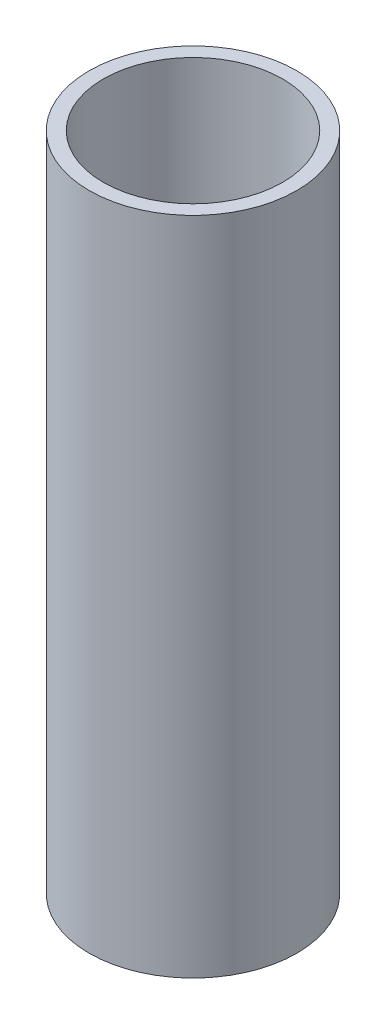
ISO-10303-21;
HEADER;
FILE_DESCRIPTION(('STEP AP214'),'2;1');
FILE_NAME('part.step','',(''),(''),'','','');
FILE_SCHEMA(('AUTOMOTIVE_DESIGN { 1 0 10303 214 1 1 1 1 }'));
ENDSEC;
DATA;
#1=APPLICATION_CONTEXT('core data for automotive mechanical design processes');
#2=APPLICATION_PROTOCOL_DEFINITION('international standard','automotive_design',2000,#1);
#3=PRODUCT_CONTEXT('',#1,'mechanical');
#4=PRODUCT('Part','Part','',(#3));
#5=PRODUCT_RELATED_PRODUCT_CATEGORY('part','',(#4));
#6=PRODUCT_DEFINITION_FORMATION('','',#4);
#7=PRODUCT_DEFINITION_CONTEXT('part definition',#1,'design');
#8=PRODUCT_DEFINITION('design','',#6,#7);
#9=PRODUCT_DEFINITION_SHAPE('','',#8);
#10=(LENGTH_UNIT() NAMED_UNIT(*) SI_UNIT(.MILLI.,.METRE.));
#11=(NAMED_UNIT(*) PLANE_ANGLE_UNIT() SI_UNIT($,.RADIAN.));
#12=(NAMED_UNIT(*) SI_UNIT($,.STERADIAN.) SOLID_ANGLE_UNIT());
#13=UNCERTAINTY_MEASURE_WITH_UNIT(LENGTH_MEASURE(1.E-05),#10,'distance_accuracy_value','');
#14=(GEOMETRIC_REPRESENTATION_CONTEXT(3) GLOBAL_UNCERTAINTY_ASSIGNED_CONTEXT((#13)) GLOBAL_UNIT_ASSIGNED_CONTEXT((#10,
#11,#12)) REPRESENTATION_CONTEXT('',''));
#15=CARTESIAN_POINT('',(0.,0.,0.));
#16=DIRECTION('',(0.,0.,1.));
#17=DIRECTION('',(1.,0.,0.));
#18=AXIS2_PLACEMENT_3D('',#15,#16,#17);
#19=CARTESIAN_POINT('',(0.,0.,0.));
#20=DIRECTION('',(0.,1.,0.));
#21=DIRECTION('',(0.,0.,1.));
#22=AXIS2_PLACEMENT_3D('',#19,#20,#21);
#23=CYLINDRICAL_SURFACE('',#22,2.8);
#24=CARTESIAN_POINT('',(0.,33.5,0.));
#25=DIRECTION('',(0.,-1.,0.));
#26=DIRECTION('',(0.,0.,-1.));
#27=AXIS2_PLACEMENT_3D('',#24,#25,#26);
#28=CIRCLE('',#27,2.8);
#29=CARTESIAN_POINT('',(0.,33.5,-2.8));
#30=VERTEX_POINT('',#29);
#31=EDGE_CURVE('E44',#30,#30,#28,.F.);
#32=ORIENTED_EDGE('',*,*,#31,.F.);
#33=EDGE_LOOP('',(#32));
#34=FACE_BOUND('',#33,.T.);
#35=CARTESIAN_POINT('',(0.,36.5,0.));
#36=DIRECTION('',(0.,1.,0.));
#37=DIRECTION('',(0.,0.,1.));
#38=AXIS2_PLACEMENT_3D('',#35,#36,#37);
#39=CIRCLE('',#38,2.8);
#40=CARTESIAN_POINT('',(0.,36.5,2.8));
#41=VERTEX_POINT('',#40);
#42=EDGE_CURVE('E35',#41,#41,#39,.F.);
#43=ORIENTED_EDGE('',*,*,#42,.F.);
#44=EDGE_LOOP('',(#43));
#45=FACE_BOUND('',#44,.T.);
#46=ADVANCED_FACE('F31',(#34,#45),#23,.F.);
#47=CARTESIAN_POINT('',(0.,70.,0.));
#48=DIRECTION('',(0.,-1.,0.));
#49=DIRECTION('',(0.,0.,-1.));
#50=AXIS2_PLACEMENT_3D('',#47,#48,#49);
#51=CYLINDRICAL_SURFACE('',#50,11.);
#52=CARTESIAN_POINT('',(0.,70.,0.));
#53=DIRECTION('',(0.,1.,0.));
#54=DIRECTION('',(0.,0.,1.));
#55=AXIS2_PLACEMENT_3D('',#52,#53,#54);
#56=CIRCLE('',#55,11.);
#57=CARTESIAN_POINT('',(0.,70.,11.));
#58=VERTEX_POINT('',#57);
#59=EDGE_CURVE('E10',#58,#58,#56,.T.);
#60=ORIENTED_EDGE('',*,*,#59,.F.);
#61=EDGE_LOOP('',(#60));
#62=FACE_BOUND('',#61,.T.);
#63=CARTESIAN_POINT('',(0.,0.,0.));
#64=DIRECTION('',(0.,1.,0.));
#65=DIRECTION('',(0.,0.,1.));
#66=AXIS2_PLACEMENT_3D('',#63,#64,#65);
#67=CIRCLE('',#66,11.);
#68=CARTESIAN_POINT('',(0.,0.,11.));
#69=VERTEX_POINT('',#68);
#70=EDGE_CURVE('E39',#69,#69,#67,.T.);
#71=ORIENTED_EDGE('',*,*,#70,.T.);
#72=EDGE_LOOP('',(#71));
#73=FACE_BOUND('',#72,.T.);
#74=ADVANCED_FACE('F33',(#62,#73),#51,.T.);
#75=CARTESIAN_POINT('',(0.,70.,0.));
#76=DIRECTION('',(0.,1.,0.));
#77=DIRECTION('',(0.,0.,1.));
#78=AXIS2_PLACEMENT_3D('',#75,#76,#77);
#79=PLANE('',#78);
#80=CARTESIAN_POINT('',(0.,70.,0.));
#81=DIRECTION('',(0.,1.,0.));
#82=DIRECTION('',(0.,0.,1.));
#83=AXIS2_PLACEMENT_3D('',#80,#81,#82);
#84=CIRCLE('',#83,9.5);
#85=CARTESIAN_POINT('',(0.,70.,9.5));
#86=VERTEX_POINT('',#85);
#87=EDGE_CURVE('E58',#86,#86,#84,.T.);
#88=ORIENTED_EDGE('',*,*,#87,.F.);
#89=EDGE_LOOP('',(#88));
#90=FACE_BOUND('',#89,.T.);
#91=ORIENTED_EDGE('',*,*,#59,.T.);
#92=EDGE_LOOP('',(#91));
#93=FACE_BOUND('',#92,.T.);
#94=ADVANCED_FACE('F76',(#90,#93),#79,.T.);
#95=CARTESIAN_POINT('',(0.,0.,0.));
#96=DIRECTION('',(0.,1.,0.));
#97=DIRECTION('',(0.,0.,1.));
#98=AXIS2_PLACEMENT_3D('',#95,#96,#97);
#99=PLANE('',#98);
#100=CARTESIAN_POINT('',(0.,0.,0.));
#101=DIRECTION('',(0.,-1.,0.));
#102=DIRECTION('',(0.,0.,-1.));
#103=AXIS2_PLACEMENT_3D('',#100,#101,#102);
#104=CIRCLE('',#103,9.5);
#105=CARTESIAN_POINT('',(0.,0.,-9.5));
#106=VERTEX_POINT('',#105);
#107=EDGE_CURVE('E47',#106,#106,#104,.T.);
#108=ORIENTED_EDGE('',*,*,#107,.F.);
#109=EDGE_LOOP('',(#108));
#110=FACE_BOUND('',#109,.T.);
#111=ORIENTED_EDGE('',*,*,#70,.F.);
#112=EDGE_LOOP('',(#111));
#113=FACE_BOUND('',#112,.T.);
#114=ADVANCED_FACE('F83',(#110,#113),#99,.F.);
#115=CARTESIAN_POINT('',(0.,33.5,0.));
#116=DIRECTION('',(0.,-1.,0.));
#117=DIRECTION('',(0.,0.,-1.));
#118=AXIS2_PLACEMENT_3D('',#115,#116,#117);
#119=PLANE('',#118);
#120=CARTESIAN_POINT('',(0.,33.5,0.));
#121=DIRECTION('',(0.,-1.,0.));
#122=DIRECTION('',(0.,0.,-1.));
#123=AXIS2_PLACEMENT_3D('',#120,#121,#122);
#124=CIRCLE('',#123,9.5);
#125=CARTESIAN_POINT('',(0.,33.5,-9.5));
#126=VERTEX_POINT('',#125);
#127=EDGE_CURVE('E50',#126,#126,#124,.T.);
#128=ORIENTED_EDGE('',*,*,#127,.T.);
#129=EDGE_LOOP('',(#128));
#130=FACE_BOUND('',#129,.T.);
#131=ORIENTED_EDGE('',*,*,#31,.T.);
#132=EDGE_LOOP('',(#131));
#133=FACE_BOUND('',#132,.T.);
#134=ADVANCED_FACE('F86',(#130,#133),#119,.T.);
#135=CARTESIAN_POINT('',(0.,33.5,0.));
#136=DIRECTION('',(0.,-1.,0.));
#137=DIRECTION('',(0.,0.,-1.));
#138=AXIS2_PLACEMENT_3D('',#135,#136,#137);
#139=CYLINDRICAL_SURFACE('',#138,9.5);
#140=ORIENTED_EDGE('',*,*,#127,.F.);
#141=EDGE_LOOP('',(#140));
#142=FACE_BOUND('',#141,.T.);
#143=ORIENTED_EDGE('',*,*,#107,.T.);
#144=EDGE_LOOP('',(#143));
#145=FACE_BOUND('',#144,.T.);
#146=ADVANCED_FACE('F80',(#142,#145),#139,.F.);
#147=CARTESIAN_POINT('',(0.,36.5,0.));
#148=DIRECTION('',(0.,1.,0.));
#149=DIRECTION('',(0.,0.,1.));
#150=AXIS2_PLACEMENT_3D('',#147,#148,#149);
#151=PLANE('',#150);
#152=CARTESIAN_POINT('',(0.,36.5,0.));
#153=DIRECTION('',(0.,1.,0.));
#154=DIRECTION('',(0.,0.,1.));
#155=AXIS2_PLACEMENT_3D('',#152,#153,#154);
#156=CIRCLE('',#155,9.5);
#157=CARTESIAN_POINT('',(0.,36.5,9.5));
#158=VERTEX_POINT('',#157);
#159=EDGE_CURVE('E61',#158,#158,#156,.T.);
#160=ORIENTED_EDGE('',*,*,#159,.T.);
#161=EDGE_LOOP('',(#160));
#162=FACE_BOUND('',#161,.T.);
#163=ORIENTED_EDGE('',*,*,#42,.T.);
#164=EDGE_LOOP('',(#163));
#165=FACE_BOUND('',#164,.T.);
#166=ADVANCED_FACE('F68',(#162,#165),#151,.T.);
#167=CARTESIAN_POINT('',(0.,36.5,0.));
#168=DIRECTION('',(0.,1.,0.));
#169=DIRECTION('',(0.,0.,1.));
#170=AXIS2_PLACEMENT_3D('',#167,#168,#169);
#171=CYLINDRICAL_SURFACE('',#170,9.5);
#172=ORIENTED_EDGE('',*,*,#159,.F.);
#173=EDGE_LOOP('',(#172));
#174=FACE_BOUND('',#173,.T.);
#175=ORIENTED_EDGE('',*,*,#87,.T.);
#176=EDGE_LOOP('',(#175));
#177=FACE_BOUND('',#176,.T.);
#178=ADVANCED_FACE('F101',(#174,#177),#171,.F.);
#179=CLOSED_SHELL('',(#46,#74,#94,#114,#134,#146,#166,#178));
#180=MANIFOLD_SOLID_BREP('B2',#179);
#181=ADVANCED_BREP_SHAPE_REPRESENTATION('',(#18,#180),#14);
#182=SHAPE_DEFINITION_REPRESENTATION(#9,#181);
ENDSEC;
END-ISO-10303-21;
